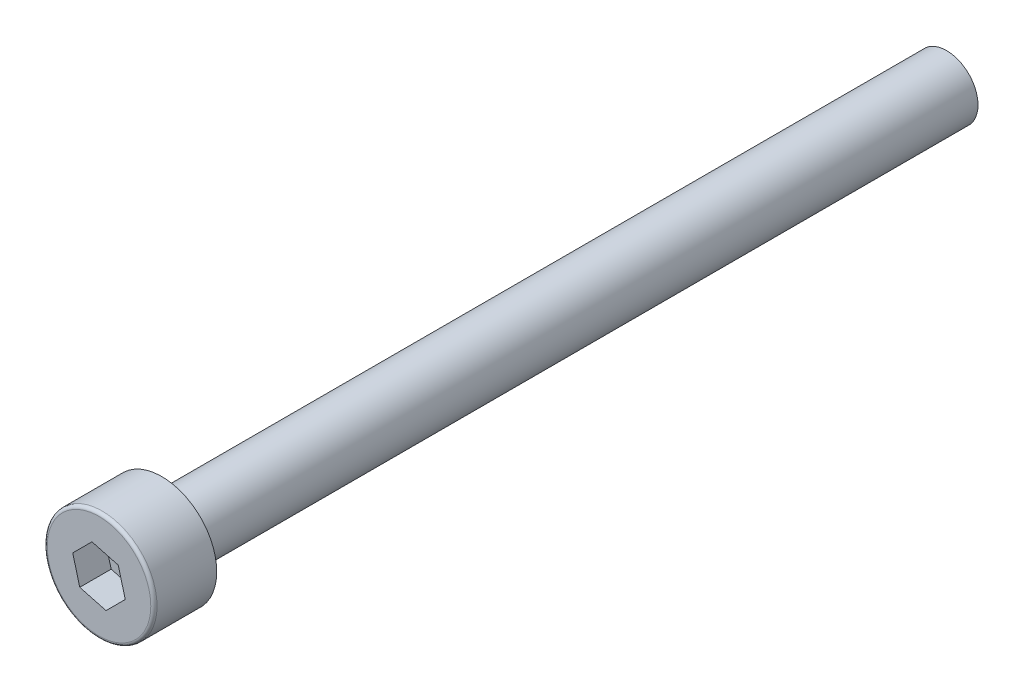
ISO-10303-21;
HEADER;
FILE_DESCRIPTION(('STEP AP214'),'2;1');
FILE_NAME('part.step','',(''),(''),'','','');
FILE_SCHEMA(('AUTOMOTIVE_DESIGN { 1 0 10303 214 1 1 1 1 }'));
ENDSEC;
DATA;
#1=APPLICATION_CONTEXT('core data for automotive mechanical design processes');
#2=APPLICATION_PROTOCOL_DEFINITION('international standard','automotive_design',2000,#1);
#3=PRODUCT_CONTEXT('',#1,'mechanical');
#4=PRODUCT('Part','Part','',(#3));
#5=PRODUCT_RELATED_PRODUCT_CATEGORY('part','',(#4));
#6=PRODUCT_DEFINITION_FORMATION('','',#4);
#7=PRODUCT_DEFINITION_CONTEXT('part definition',#1,'design');
#8=PRODUCT_DEFINITION('design','',#6,#7);
#9=PRODUCT_DEFINITION_SHAPE('','',#8);
#10=(LENGTH_UNIT() NAMED_UNIT(*) SI_UNIT(.MILLI.,.METRE.));
#11=(NAMED_UNIT(*) PLANE_ANGLE_UNIT() SI_UNIT($,.RADIAN.));
#12=(NAMED_UNIT(*) SI_UNIT($,.STERADIAN.) SOLID_ANGLE_UNIT());
#13=UNCERTAINTY_MEASURE_WITH_UNIT(LENGTH_MEASURE(1.E-05),#10,'distance_accuracy_value','');
#14=(GEOMETRIC_REPRESENTATION_CONTEXT(3) GLOBAL_UNCERTAINTY_ASSIGNED_CONTEXT((#13)) GLOBAL_UNIT_ASSIGNED_CONTEXT((#10,
#11,#12)) REPRESENTATION_CONTEXT('',''));
#15=CARTESIAN_POINT('',(0.,0.,0.));
#16=DIRECTION('',(0.,0.,1.));
#17=DIRECTION('',(1.,0.,0.));
#18=AXIS2_PLACEMENT_3D('',#15,#16,#17);
#19=CARTESIAN_POINT('',(0.,0.,0.));
#20=DIRECTION('',(0.,0.,1.));
#21=DIRECTION('',(1.,0.,0.));
#22=AXIS2_PLACEMENT_3D('',#19,#20,#21);
#23=PLANE('',#22);
#24=CARTESIAN_POINT('',(0.,0.,0.));
#25=DIRECTION('',(0.,0.,1.));
#26=DIRECTION('',(1.,0.,0.));
#27=AXIS2_PLACEMENT_3D('',#24,#25,#26);
#28=CIRCLE('',#27,3.5);
#29=CARTESIAN_POINT('',(3.5,0.,0.));
#30=VERTEX_POINT('',#29);
#31=EDGE_CURVE('E137',#30,#30,#28,.T.);
#32=ORIENTED_EDGE('',*,*,#31,.F.);
#33=EDGE_LOOP('',(#32));
#34=FACE_BOUND('',#33,.T.);
#35=CARTESIAN_POINT('',(0.,0.,0.));
#36=DIRECTION('',(0.,0.,1.));
#37=DIRECTION('',(1.,0.,0.));
#38=AXIS2_PLACEMENT_3D('',#35,#36,#37);
#39=CIRCLE('',#38,2.);
#40=CARTESIAN_POINT('',(2.,0.,0.));
#41=VERTEX_POINT('',#40);
#42=EDGE_CURVE('E145',#41,#41,#39,.F.);
#43=ORIENTED_EDGE('',*,*,#42,.F.);
#44=EDGE_LOOP('',(#43));
#45=FACE_BOUND('',#44,.T.);
#46=ADVANCED_FACE('F34',(#34,#45),#23,.F.);
#47=CARTESIAN_POINT('',(0.,0.,4.));
#48=DIRECTION('',(0.,0.,-1.));
#49=DIRECTION('',(-1.,0.,0.));
#50=AXIS2_PLACEMENT_3D('',#47,#48,#49);
#51=CYLINDRICAL_SURFACE('',#50,3.5);
#52=CARTESIAN_POINT('',(0.,0.,3.8));
#53=DIRECTION('',(0.,0.,1.));
#54=DIRECTION('',(1.,0.,0.));
#55=AXIS2_PLACEMENT_3D('',#52,#53,#54);
#56=CIRCLE('',#55,3.5);
#57=CARTESIAN_POINT('',(3.5,0.,3.8));
#58=VERTEX_POINT('',#57);
#59=EDGE_CURVE('E11',#58,#58,#56,.F.);
#60=ORIENTED_EDGE('',*,*,#59,.T.);
#61=EDGE_LOOP('',(#60));
#62=FACE_BOUND('',#61,.T.);
#63=ORIENTED_EDGE('',*,*,#31,.T.);
#64=EDGE_LOOP('',(#63));
#65=FACE_BOUND('',#64,.T.);
#66=ADVANCED_FACE('F164',(#62,#65),#51,.T.);
#67=CARTESIAN_POINT('',(0.,0.,4.));
#68=DIRECTION('',(0.,0.,1.));
#69=DIRECTION('',(1.,0.,0.));
#70=AXIS2_PLACEMENT_3D('',#67,#68,#69);
#71=PLANE('',#70);
#72=CARTESIAN_POINT('',(0.,0.,4.));
#73=DIRECTION('',(0.,0.,1.));
#74=DIRECTION('',(1.,0.,0.));
#75=AXIS2_PLACEMENT_3D('',#72,#73,#74);
#76=CIRCLE('',#75,3.3);
#77=CARTESIAN_POINT('',(3.3,0.,4.));
#78=VERTEX_POINT('',#77);
#79=EDGE_CURVE('E42',#78,#78,#76,.T.);
#80=ORIENTED_EDGE('',*,*,#79,.T.);
#81=EDGE_LOOP('',(#80));
#82=FACE_BOUND('',#81,.T.);
#83=DIRECTION('',(0.258819045102521,-0.965925826289068,0.));
#84=VECTOR('',#83,1.);
#85=CARTESIAN_POINT('',(-1.67303260747562,0.448287736084027,4.));
#86=LINE('',#85,#84);
#87=CARTESIAN_POINT('',(-1.67303260747562,0.448287736084027,4.));
#88=VERTEX_POINT('',#87);
#89=CARTESIAN_POINT('',(-1.22474487139159,-1.22474487139159,4.));
#90=VERTEX_POINT('',#89);
#91=EDGE_CURVE('E49',#88,#90,#86,.T.);
#92=ORIENTED_EDGE('',*,*,#91,.F.);
#93=DIRECTION('',(-0.707106781186547,-0.707106781186548,0.));
#94=VECTOR('',#93,1.);
#95=CARTESIAN_POINT('',(-0.448287736084027,1.67303260747562,4.));
#96=LINE('',#95,#94);
#97=CARTESIAN_POINT('',(-0.448287736084027,1.67303260747562,4.));
#98=VERTEX_POINT('',#97);
#99=EDGE_CURVE('E133',#98,#88,#96,.T.);
#100=ORIENTED_EDGE('',*,*,#99,.F.);
#101=DIRECTION('',(-0.965925826289068,0.258819045102521,0.));
#102=VECTOR('',#101,1.);
#103=CARTESIAN_POINT('',(1.22474487139159,1.22474487139159,4.));
#104=LINE('',#103,#102);
#105=CARTESIAN_POINT('',(1.22474487139159,1.22474487139159,4.));
#106=VERTEX_POINT('',#105);
#107=EDGE_CURVE('E131',#106,#98,#104,.T.);
#108=ORIENTED_EDGE('',*,*,#107,.F.);
#109=DIRECTION('',(-0.258819045102521,0.965925826289068,0.));
#110=VECTOR('',#109,1.);
#111=CARTESIAN_POINT('',(1.67303260747562,-0.448287736084027,4.));
#112=LINE('',#111,#110);
#113=CARTESIAN_POINT('',(1.67303260747562,-0.448287736084027,4.));
#114=VERTEX_POINT('',#113);
#115=EDGE_CURVE('E97',#114,#106,#112,.T.);
#116=ORIENTED_EDGE('',*,*,#115,.F.);
#117=DIRECTION('',(0.707106781186547,0.707106781186548,0.));
#118=VECTOR('',#117,1.);
#119=CARTESIAN_POINT('',(0.448287736084026,-1.67303260747562,4.));
#120=LINE('',#119,#118);
#121=CARTESIAN_POINT('',(0.448287736084026,-1.67303260747562,4.));
#122=VERTEX_POINT('',#121);
#123=EDGE_CURVE('E127',#122,#114,#120,.T.);
#124=ORIENTED_EDGE('',*,*,#123,.F.);
#125=DIRECTION('',(0.965925826289068,-0.258819045102521,0.));
#126=VECTOR('',#125,1.);
#127=CARTESIAN_POINT('',(-1.22474487139159,-1.22474487139159,4.));
#128=LINE('',#127,#126);
#129=EDGE_CURVE('E123',#90,#122,#128,.T.);
#130=ORIENTED_EDGE('',*,*,#129,.F.);
#131=EDGE_LOOP('',(#92,#100,#108,#116,#124,#130));
#132=FACE_BOUND('',#131,.T.);
#133=ADVANCED_FACE('F150',(#82,#132),#71,.T.);
#134=CARTESIAN_POINT('',(-1.67303260747562,0.448287736084027,2.));
#135=DIRECTION('',(-0.965925826289068,-0.258819045102521,0.));
#136=DIRECTION('',(0.258819045102521,-0.965925826289068,0.));
#137=AXIS2_PLACEMENT_3D('',#134,#135,#136);
#138=PLANE('',#137);
#139=ORIENTED_EDGE('',*,*,#91,.T.);
#140=DIRECTION('',(0.,0.,1.));
#141=VECTOR('',#140,1.);
#142=CARTESIAN_POINT('',(-1.22474487139159,-1.22474487139159,2.));
#143=LINE('',#142,#141);
#144=CARTESIAN_POINT('',(-1.22474487139159,-1.22474487139159,2.));
#145=VERTEX_POINT('',#144);
#146=EDGE_CURVE('E79',#145,#90,#143,.T.);
#147=ORIENTED_EDGE('',*,*,#146,.F.);
#148=DIRECTION('',(0.258819045102521,-0.965925826289068,0.));
#149=VECTOR('',#148,1.);
#150=CARTESIAN_POINT('',(-1.67303260747562,0.448287736084027,2.));
#151=LINE('',#150,#149);
#152=CARTESIAN_POINT('',(-1.67303260747562,0.448287736084027,2.));
#153=VERTEX_POINT('',#152);
#154=EDGE_CURVE('E135',#153,#145,#151,.T.);
#155=ORIENTED_EDGE('',*,*,#154,.F.);
#156=DIRECTION('',(0.,0.,1.));
#157=VECTOR('',#156,1.);
#158=CARTESIAN_POINT('',(-1.67303260747562,0.448287736084027,2.));
#159=LINE('',#158,#157);
#160=EDGE_CURVE('E57',#153,#88,#159,.T.);
#161=ORIENTED_EDGE('',*,*,#160,.T.);
#162=EDGE_LOOP('',(#139,#147,#155,#161));
#163=FACE_BOUND('',#162,.T.);
#164=ADVANCED_FACE('F176',(#163),#138,.F.);
#165=CARTESIAN_POINT('',(-0.448287736084027,1.67303260747562,2.));
#166=DIRECTION('',(-0.707106781186548,0.707106781186547,0.));
#167=DIRECTION('',(-0.707106781186547,-0.707106781186548,0.));
#168=AXIS2_PLACEMENT_3D('',#165,#166,#167);
#169=PLANE('',#168);
#170=ORIENTED_EDGE('',*,*,#99,.T.);
#171=ORIENTED_EDGE('',*,*,#160,.F.);
#172=DIRECTION('',(-0.707106781186547,-0.707106781186548,0.));
#173=VECTOR('',#172,1.);
#174=CARTESIAN_POINT('',(-0.448287736084027,1.67303260747562,2.));
#175=LINE('',#174,#173);
#176=CARTESIAN_POINT('',(-0.448287736084027,1.67303260747562,2.));
#177=VERTEX_POINT('',#176);
#178=EDGE_CURVE('E109',#177,#153,#175,.T.);
#179=ORIENTED_EDGE('',*,*,#178,.F.);
#180=DIRECTION('',(0.,0.,1.));
#181=VECTOR('',#180,1.);
#182=CARTESIAN_POINT('',(-0.448287736084027,1.67303260747562,2.));
#183=LINE('',#182,#181);
#184=EDGE_CURVE('E101',#177,#98,#183,.T.);
#185=ORIENTED_EDGE('',*,*,#184,.T.);
#186=EDGE_LOOP('',(#170,#171,#179,#185));
#187=FACE_BOUND('',#186,.T.);
#188=ADVANCED_FACE('F179',(#187),#169,.F.);
#189=CARTESIAN_POINT('',(1.22474487139159,1.22474487139159,2.));
#190=DIRECTION('',(0.258819045102521,0.965925826289068,0.));
#191=DIRECTION('',(-0.965925826289068,0.258819045102521,0.));
#192=AXIS2_PLACEMENT_3D('',#189,#190,#191);
#193=PLANE('',#192);
#194=ORIENTED_EDGE('',*,*,#107,.T.);
#195=ORIENTED_EDGE('',*,*,#184,.F.);
#196=DIRECTION('',(-0.965925826289068,0.258819045102521,0.));
#197=VECTOR('',#196,1.);
#198=CARTESIAN_POINT('',(1.22474487139159,1.22474487139159,2.));
#199=LINE('',#198,#197);
#200=CARTESIAN_POINT('',(1.22474487139159,1.22474487139159,2.));
#201=VERTEX_POINT('',#200);
#202=EDGE_CURVE('E105',#201,#177,#199,.T.);
#203=ORIENTED_EDGE('',*,*,#202,.F.);
#204=DIRECTION('',(0.,0.,1.));
#205=VECTOR('',#204,1.);
#206=CARTESIAN_POINT('',(1.22474487139159,1.22474487139159,2.));
#207=LINE('',#206,#205);
#208=EDGE_CURVE('E90',#201,#106,#207,.T.);
#209=ORIENTED_EDGE('',*,*,#208,.T.);
#210=EDGE_LOOP('',(#194,#195,#203,#209));
#211=FACE_BOUND('',#210,.T.);
#212=ADVANCED_FACE('F106',(#211),#193,.F.);
#213=CARTESIAN_POINT('',(1.67303260747562,-0.448287736084027,2.));
#214=DIRECTION('',(0.965925826289068,0.258819045102521,0.));
#215=DIRECTION('',(-0.258819045102521,0.965925826289068,0.));
#216=AXIS2_PLACEMENT_3D('',#213,#214,#215);
#217=PLANE('',#216);
#218=ORIENTED_EDGE('',*,*,#115,.T.);
#219=ORIENTED_EDGE('',*,*,#208,.F.);
#220=DIRECTION('',(-0.258819045102521,0.965925826289068,0.));
#221=VECTOR('',#220,1.);
#222=CARTESIAN_POINT('',(1.67303260747562,-0.448287736084027,2.));
#223=LINE('',#222,#221);
#224=CARTESIAN_POINT('',(1.67303260747562,-0.448287736084027,2.));
#225=VERTEX_POINT('',#224);
#226=EDGE_CURVE('E94',#225,#201,#223,.T.);
#227=ORIENTED_EDGE('',*,*,#226,.F.);
#228=DIRECTION('',(0.,0.,1.));
#229=VECTOR('',#228,1.);
#230=CARTESIAN_POINT('',(1.67303260747562,-0.448287736084027,2.));
#231=LINE('',#230,#229);
#232=EDGE_CURVE('E102',#225,#114,#231,.T.);
#233=ORIENTED_EDGE('',*,*,#232,.T.);
#234=EDGE_LOOP('',(#218,#219,#227,#233));
#235=FACE_BOUND('',#234,.T.);
#236=ADVANCED_FACE('F92',(#235),#217,.F.);
#237=CARTESIAN_POINT('',(0.448287736084026,-1.67303260747562,2.));
#238=DIRECTION('',(0.707106781186548,-0.707106781186547,0.));
#239=DIRECTION('',(0.707106781186547,0.707106781186548,0.));
#240=AXIS2_PLACEMENT_3D('',#237,#238,#239);
#241=PLANE('',#240);
#242=ORIENTED_EDGE('',*,*,#123,.T.);
#243=ORIENTED_EDGE('',*,*,#232,.F.);
#244=DIRECTION('',(0.707106781186547,0.707106781186548,0.));
#245=VECTOR('',#244,1.);
#246=CARTESIAN_POINT('',(0.448287736084026,-1.67303260747562,2.));
#247=LINE('',#246,#245);
#248=CARTESIAN_POINT('',(0.448287736084026,-1.67303260747562,2.));
#249=VERTEX_POINT('',#248);
#250=EDGE_CURVE('E115',#249,#225,#247,.T.);
#251=ORIENTED_EDGE('',*,*,#250,.F.);
#252=DIRECTION('',(0.,0.,1.));
#253=VECTOR('',#252,1.);
#254=CARTESIAN_POINT('',(0.448287736084026,-1.67303260747562,2.));
#255=LINE('',#254,#253);
#256=EDGE_CURVE('E140',#249,#122,#255,.T.);
#257=ORIENTED_EDGE('',*,*,#256,.T.);
#258=EDGE_LOOP('',(#242,#243,#251,#257));
#259=FACE_BOUND('',#258,.T.);
#260=ADVANCED_FACE('F183',(#259),#241,.F.);
#261=CARTESIAN_POINT('',(-1.22474487139159,-1.22474487139159,2.));
#262=DIRECTION('',(-0.258819045102521,-0.965925826289068,0.));
#263=DIRECTION('',(0.965925826289068,-0.258819045102521,0.));
#264=AXIS2_PLACEMENT_3D('',#261,#262,#263);
#265=PLANE('',#264);
#266=ORIENTED_EDGE('',*,*,#129,.T.);
#267=ORIENTED_EDGE('',*,*,#256,.F.);
#268=DIRECTION('',(0.965925826289068,-0.258819045102521,0.));
#269=VECTOR('',#268,1.);
#270=CARTESIAN_POINT('',(-1.22474487139159,-1.22474487139159,2.));
#271=LINE('',#270,#269);
#272=EDGE_CURVE('E117',#145,#249,#271,.T.);
#273=ORIENTED_EDGE('',*,*,#272,.F.);
#274=ORIENTED_EDGE('',*,*,#146,.T.);
#275=EDGE_LOOP('',(#266,#267,#273,#274));
#276=FACE_BOUND('',#275,.T.);
#277=ADVANCED_FACE('F180',(#276),#265,.F.);
#278=CARTESIAN_POINT('',(0.,0.,2.));
#279=DIRECTION('',(0.,0.,1.));
#280=DIRECTION('',(1.,0.,0.));
#281=AXIS2_PLACEMENT_3D('',#278,#279,#280);
#282=PLANE('',#281);
#283=ORIENTED_EDGE('',*,*,#154,.T.);
#284=ORIENTED_EDGE('',*,*,#272,.T.);
#285=ORIENTED_EDGE('',*,*,#250,.T.);
#286=ORIENTED_EDGE('',*,*,#226,.T.);
#287=ORIENTED_EDGE('',*,*,#202,.T.);
#288=ORIENTED_EDGE('',*,*,#178,.T.);
#289=EDGE_LOOP('',(#283,#284,#285,#286,#287,#288));
#290=FACE_BOUND('',#289,.T.);
#291=ADVANCED_FACE('F112',(#290),#282,.T.);
#292=CARTESIAN_POINT('',(0.,0.,-50.));
#293=DIRECTION('',(0.,0.,1.));
#294=DIRECTION('',(1.,0.,0.));
#295=AXIS2_PLACEMENT_3D('',#292,#293,#294);
#296=CYLINDRICAL_SURFACE('',#295,2.);
#297=CARTESIAN_POINT('',(0.,0.,-50.));
#298=DIRECTION('',(0.,0.,-1.));
#299=DIRECTION('',(-1.,0.,0.));
#300=AXIS2_PLACEMENT_3D('',#297,#298,#299);
#301=CIRCLE('',#300,2.);
#302=CARTESIAN_POINT('',(-2.,0.,-50.));
#303=VERTEX_POINT('',#302);
#304=EDGE_CURVE('E124',#303,#303,#301,.T.);
#305=ORIENTED_EDGE('',*,*,#304,.F.);
#306=EDGE_LOOP('',(#305));
#307=FACE_BOUND('',#306,.T.);
#308=ORIENTED_EDGE('',*,*,#42,.T.);
#309=EDGE_LOOP('',(#308));
#310=FACE_BOUND('',#309,.T.);
#311=ADVANCED_FACE('F159',(#307,#310),#296,.T.);
#312=CARTESIAN_POINT('',(0.,0.,-50.));
#313=DIRECTION('',(0.,0.,-1.));
#314=DIRECTION('',(-1.,0.,0.));
#315=AXIS2_PLACEMENT_3D('',#312,#313,#314);
#316=PLANE('',#315);
#317=ORIENTED_EDGE('',*,*,#304,.T.);
#318=EDGE_LOOP('',(#317));
#319=FACE_BOUND('',#318,.T.);
#320=ADVANCED_FACE('F154',(#319),#316,.T.);
#321=CARTESIAN_POINT('',(0.,0.,3.8));
#322=DIRECTION('',(0.,0.,1.));
#323=DIRECTION('',(1.,0.,0.));
#324=AXIS2_PLACEMENT_3D('',#321,#322,#323);
#325=TOROIDAL_SURFACE('',#324,3.3,0.2);
#326=ORIENTED_EDGE('',*,*,#59,.F.);
#327=EDGE_LOOP('',(#326));
#328=FACE_BOUND('',#327,.T.);
#329=ORIENTED_EDGE('',*,*,#79,.F.);
#330=EDGE_LOOP('',(#329));
#331=FACE_BOUND('',#330,.T.);
#332=ADVANCED_FACE('F36',(#328,#331),#325,.T.);
#333=CLOSED_SHELL('',(#46,#66,#133,#164,#188,#212,#236,#260,#277,#291,#311,#320,#332));
#334=MANIFOLD_SOLID_BREP('B2',#333);
#335=ADVANCED_BREP_SHAPE_REPRESENTATION('',(#18,#334),#14);
#336=SHAPE_DEFINITION_REPRESENTATION(#9,#335);
ENDSEC;
END-ISO-10303-21;
